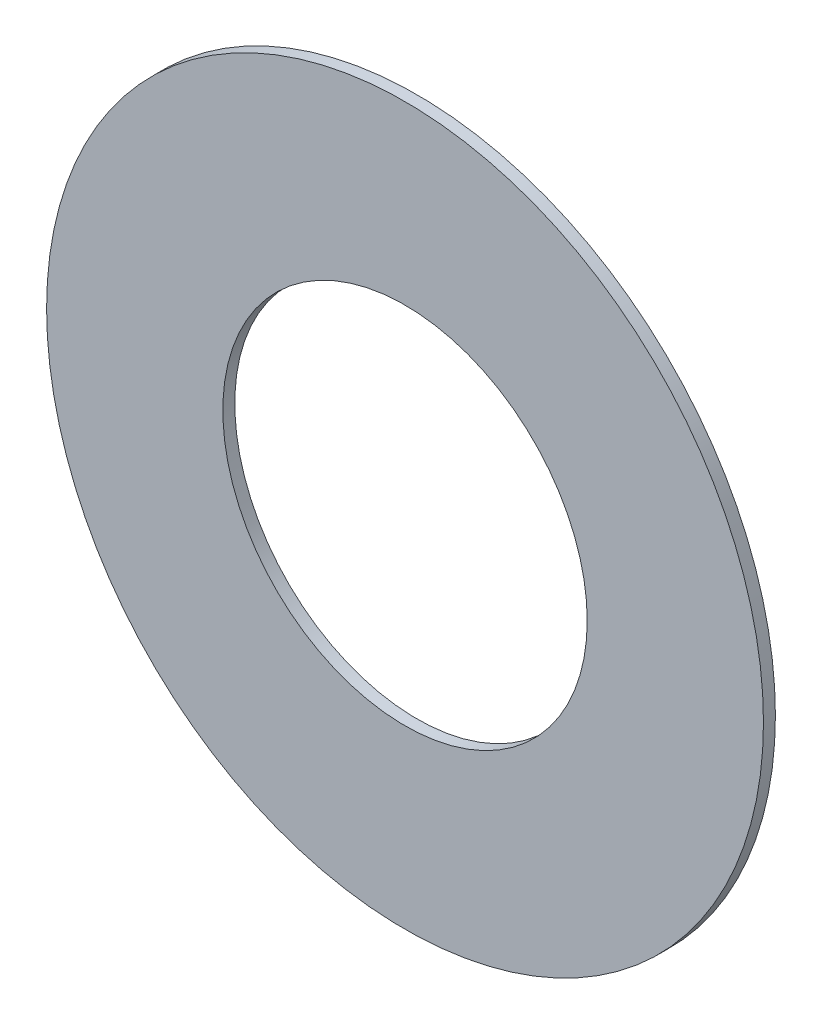
ISO-10303-21;
HEADER;
FILE_DESCRIPTION(('STEP AP214'),'2;1');
FILE_NAME('part.step','',(''),(''),'','','');
FILE_SCHEMA(('AUTOMOTIVE_DESIGN { 1 0 10303 214 1 1 1 1 }'));
ENDSEC;
DATA;
#1=APPLICATION_CONTEXT('core data for automotive mechanical design processes');
#2=APPLICATION_PROTOCOL_DEFINITION('international standard','automotive_design',2000,#1);
#3=PRODUCT_CONTEXT('',#1,'mechanical');
#4=PRODUCT('Part','Part','',(#3));
#5=PRODUCT_RELATED_PRODUCT_CATEGORY('part','',(#4));
#6=PRODUCT_DEFINITION_FORMATION('','',#4);
#7=PRODUCT_DEFINITION_CONTEXT('part definition',#1,'design');
#8=PRODUCT_DEFINITION('design','',#6,#7);
#9=PRODUCT_DEFINITION_SHAPE('','',#8);
#10=(LENGTH_UNIT() NAMED_UNIT(*) SI_UNIT(.MILLI.,.METRE.));
#11=(NAMED_UNIT(*) PLANE_ANGLE_UNIT() SI_UNIT($,.RADIAN.));
#12=(NAMED_UNIT(*) SI_UNIT($,.STERADIAN.) SOLID_ANGLE_UNIT());
#13=UNCERTAINTY_MEASURE_WITH_UNIT(LENGTH_MEASURE(1.E-05),#10,'distance_accuracy_value','');
#14=(GEOMETRIC_REPRESENTATION_CONTEXT(3) GLOBAL_UNCERTAINTY_ASSIGNED_CONTEXT((#13)) GLOBAL_UNIT_ASSIGNED_CONTEXT((#10,
#11,#12)) REPRESENTATION_CONTEXT('',''));
#15=CARTESIAN_POINT('',(0.,0.,0.));
#16=DIRECTION('',(0.,0.,1.));
#17=DIRECTION('',(1.,0.,0.));
#18=AXIS2_PLACEMENT_3D('',#15,#16,#17);
#19=CARTESIAN_POINT('',(0.,0.,0.399999999999998));
#20=DIRECTION('',(0.,0.,1.));
#21=DIRECTION('',(1.,0.,0.));
#22=AXIS2_PLACEMENT_3D('',#19,#20,#21);
#23=PLANE('',#22);
#24=CARTESIAN_POINT('',(0.,0.,0.399999999999998));
#25=DIRECTION('',(0.,0.,1.));
#26=DIRECTION('',(1.,0.,0.));
#27=AXIS2_PLACEMENT_3D('',#24,#25,#26);
#28=CIRCLE('',#27,12.);
#29=CARTESIAN_POINT('',(12.,0.,0.399999999999998));
#30=VERTEX_POINT('',#29);
#31=EDGE_CURVE('E10',#30,#30,#28,.T.);
#32=ORIENTED_EDGE('',*,*,#31,.T.);
#33=EDGE_LOOP('',(#32));
#34=FACE_BOUND('',#33,.T.);
#35=CARTESIAN_POINT('',(0.,0.,0.399999999999998));
#36=DIRECTION('',(0.,0.,1.));
#37=DIRECTION('',(1.,0.,0.));
#38=AXIS2_PLACEMENT_3D('',#35,#36,#37);
#39=CIRCLE('',#38,6.1);
#40=CARTESIAN_POINT('',(6.1,0.,0.399999999999998));
#41=VERTEX_POINT('',#40);
#42=EDGE_CURVE('E47',#41,#41,#39,.T.);
#43=ORIENTED_EDGE('',*,*,#42,.F.);
#44=EDGE_LOOP('',(#43));
#45=FACE_BOUND('',#44,.T.);
#46=ADVANCED_FACE('F34',(#34,#45),#23,.T.);
#47=CARTESIAN_POINT('',(0.,0.,0.));
#48=DIRECTION('',(0.,0.,1.));
#49=DIRECTION('',(1.,0.,0.));
#50=AXIS2_PLACEMENT_3D('',#47,#48,#49);
#51=PLANE('',#50);
#52=CARTESIAN_POINT('',(0.,0.,0.));
#53=DIRECTION('',(0.,0.,1.));
#54=DIRECTION('',(1.,0.,0.));
#55=AXIS2_PLACEMENT_3D('',#52,#53,#54);
#56=CIRCLE('',#55,12.);
#57=CARTESIAN_POINT('',(12.,0.,0.));
#58=VERTEX_POINT('',#57);
#59=EDGE_CURVE('E39',#58,#58,#56,.T.);
#60=ORIENTED_EDGE('',*,*,#59,.F.);
#61=EDGE_LOOP('',(#60));
#62=FACE_BOUND('',#61,.T.);
#63=CARTESIAN_POINT('',(0.,0.,0.));
#64=DIRECTION('',(0.,0.,1.));
#65=DIRECTION('',(1.,0.,0.));
#66=AXIS2_PLACEMENT_3D('',#63,#64,#65);
#67=CIRCLE('',#66,6.1);
#68=CARTESIAN_POINT('',(6.1,0.,0.));
#69=VERTEX_POINT('',#68);
#70=EDGE_CURVE('E51',#69,#69,#67,.T.);
#71=ORIENTED_EDGE('',*,*,#70,.T.);
#72=EDGE_LOOP('',(#71));
#73=FACE_BOUND('',#72,.T.);
#74=ADVANCED_FACE('F65',(#62,#73),#51,.F.);
#75=CARTESIAN_POINT('',(0.,0.,0.399999999999998));
#76=DIRECTION('',(0.,0.,-1.));
#77=DIRECTION('',(-1.,0.,0.));
#78=AXIS2_PLACEMENT_3D('',#75,#76,#77);
#79=CYLINDRICAL_SURFACE('',#78,12.);
#80=ORIENTED_EDGE('',*,*,#31,.F.);
#81=EDGE_LOOP('',(#80));
#82=FACE_BOUND('',#81,.T.);
#83=ORIENTED_EDGE('',*,*,#59,.T.);
#84=EDGE_LOOP('',(#83));
#85=FACE_BOUND('',#84,.T.);
#86=ADVANCED_FACE('F40',(#82,#85),#79,.T.);
#87=CARTESIAN_POINT('',(0.,0.,0.399999999999998));
#88=DIRECTION('',(0.,0.,-1.));
#89=DIRECTION('',(-1.,0.,0.));
#90=AXIS2_PLACEMENT_3D('',#87,#88,#89);
#91=CYLINDRICAL_SURFACE('',#90,6.1);
#92=ORIENTED_EDGE('',*,*,#42,.T.);
#93=EDGE_LOOP('',(#92));
#94=FACE_BOUND('',#93,.T.);
#95=ORIENTED_EDGE('',*,*,#70,.F.);
#96=EDGE_LOOP('',(#95));
#97=FACE_BOUND('',#96,.T.);
#98=ADVANCED_FACE('F58',(#94,#97),#91,.F.);
#99=CLOSED_SHELL('',(#46,#74,#86,#98));
#100=MANIFOLD_SOLID_BREP('B2',#99);
#101=ADVANCED_BREP_SHAPE_REPRESENTATION('',(#18,#100),#14);
#102=SHAPE_DEFINITION_REPRESENTATION(#9,#101);
ENDSEC;
END-ISO-10303-21;
